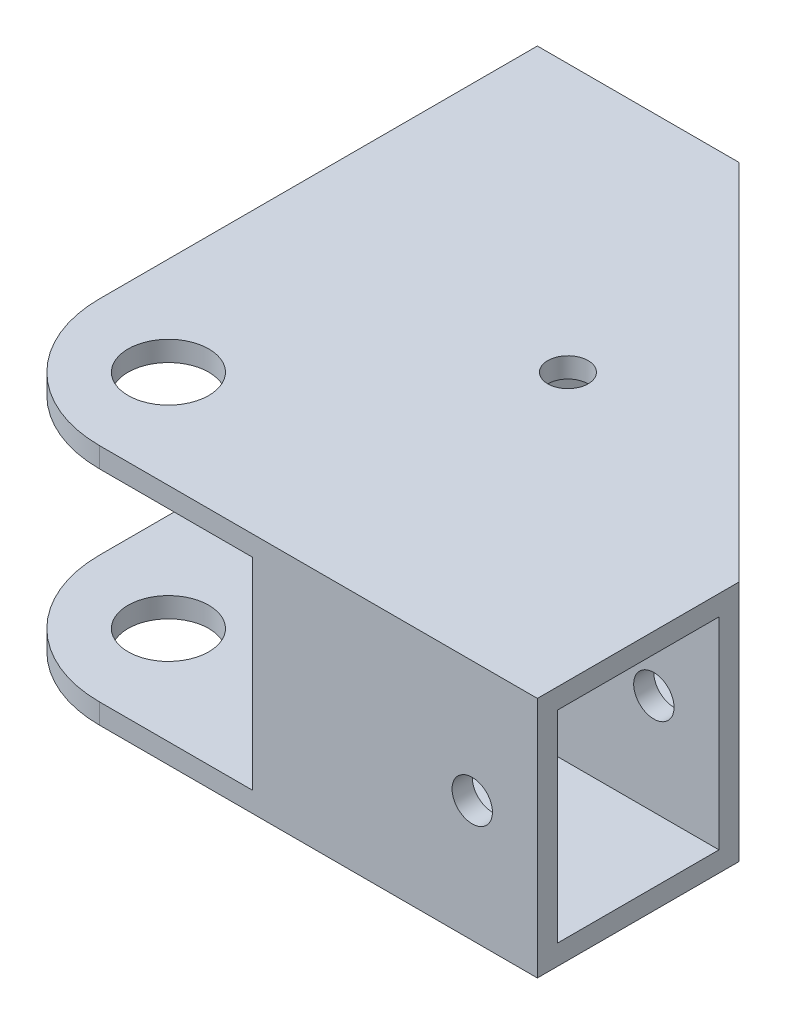
ISO-10303-21;
HEADER;
FILE_DESCRIPTION(('STEP AP214'),'2;1');
FILE_NAME('part.step','',(''),(''),'','','');
FILE_SCHEMA(('AUTOMOTIVE_DESIGN { 1 0 10303 214 1 1 1 1 }'));
ENDSEC;
DATA;
#1=APPLICATION_CONTEXT('core data for automotive mechanical design processes');
#2=APPLICATION_PROTOCOL_DEFINITION('international standard','automotive_design',2000,#1);
#3=PRODUCT_CONTEXT('',#1,'mechanical');
#4=PRODUCT('Part','Part','',(#3));
#5=PRODUCT_RELATED_PRODUCT_CATEGORY('part','',(#4));
#6=PRODUCT_DEFINITION_FORMATION('','',#4);
#7=PRODUCT_DEFINITION_CONTEXT('part definition',#1,'design');
#8=PRODUCT_DEFINITION('design','',#6,#7);
#9=PRODUCT_DEFINITION_SHAPE('','',#8);
#10=(LENGTH_UNIT() NAMED_UNIT(*) SI_UNIT(.MILLI.,.METRE.));
#11=(NAMED_UNIT(*) PLANE_ANGLE_UNIT() SI_UNIT($,.RADIAN.));
#12=(NAMED_UNIT(*) SI_UNIT($,.STERADIAN.) SOLID_ANGLE_UNIT());
#13=UNCERTAINTY_MEASURE_WITH_UNIT(LENGTH_MEASURE(1.E-05),#10,'distance_accuracy_value','');
#14=(GEOMETRIC_REPRESENTATION_CONTEXT(3) GLOBAL_UNCERTAINTY_ASSIGNED_CONTEXT((#13)) GLOBAL_UNIT_ASSIGNED_CONTEXT((#10,
#11,#12)) REPRESENTATION_CONTEXT('',''));
#15=CARTESIAN_POINT('',(0.,0.,0.));
#16=DIRECTION('',(0.,0.,1.));
#17=DIRECTION('',(1.,0.,0.));
#18=AXIS2_PLACEMENT_3D('',#15,#16,#17);
#19=CARTESIAN_POINT('',(-57.15,38.1,-31.75));
#20=DIRECTION('',(0.,0.,1.));
#21=DIRECTION('',(1.,0.,0.));
#22=AXIS2_PLACEMENT_3D('',#19,#20,#21);
#23=PLANE('',#22);
#24=CARTESIAN_POINT('',(-10.25,19.05,-31.75));
#25=DIRECTION('',(0.,0.,1.));
#26=DIRECTION('',(1.,0.,0.));
#27=AXIS2_PLACEMENT_3D('',#24,#25,#26);
#28=CIRCLE('',#27,3.175);
#29=CARTESIAN_POINT('',(-7.075,19.05,-31.75));
#30=VERTEX_POINT('',#29);
#31=EDGE_CURVE('E262',#30,#30,#28,.F.);
#32=ORIENTED_EDGE('',*,*,#31,.F.);
#33=EDGE_LOOP('',(#32));
#34=FACE_BOUND('',#33,.T.);
#35=DIRECTION('',(1.,0.,0.));
#36=VECTOR('',#35,1.);
#37=CARTESIAN_POINT('',(-57.15,3.17500000000001,-31.75));
#38=LINE('',#37,#36);
#39=CARTESIAN_POINT('',(-52.15,3.17500000000001,-31.75));
#40=VERTEX_POINT('',#39);
#41=CARTESIAN_POINT('',(0.,3.17500000000002,-31.75));
#42=VERTEX_POINT('',#41);
#43=EDGE_CURVE('E401',#40,#42,#38,.T.);
#44=ORIENTED_EDGE('',*,*,#43,.F.);
#45=DIRECTION('',(0.,-1.,0.));
#46=VECTOR('',#45,1.);
#47=CARTESIAN_POINT('',(-52.15,34.925,-31.75));
#48=LINE('',#47,#46);
#49=CARTESIAN_POINT('',(-52.15,34.925,-31.75));
#50=VERTEX_POINT('',#49);
#51=EDGE_CURVE('E196',#40,#50,#48,.F.);
#52=ORIENTED_EDGE('',*,*,#51,.T.);
#53=DIRECTION('',(1.,0.,0.));
#54=VECTOR('',#53,1.);
#55=CARTESIAN_POINT('',(-57.15,34.925,-31.75));
#56=LINE('',#55,#54);
#57=CARTESIAN_POINT('',(0.,34.925,-31.75));
#58=VERTEX_POINT('',#57);
#59=EDGE_CURVE('E189',#50,#58,#56,.T.);
#60=ORIENTED_EDGE('',*,*,#59,.T.);
#61=DIRECTION('',(0.,-1.,0.));
#62=VECTOR('',#61,1.);
#63=CARTESIAN_POINT('',(0.,38.1,-31.75));
#64=LINE('',#63,#62);
#65=EDGE_CURVE('E193',#58,#42,#64,.T.);
#66=ORIENTED_EDGE('',*,*,#65,.T.);
#67=EDGE_LOOP('',(#44,#52,#60,#66));
#68=FACE_BOUND('',#67,.T.);
#69=ADVANCED_FACE('F39',(#34,#68),#23,.F.);
#70=CARTESIAN_POINT('',(-57.15,38.1,-88.9));
#71=DIRECTION('',(-1.,0.,0.));
#72=DIRECTION('',(0.,0.,1.));
#73=AXIS2_PLACEMENT_3D('',#70,#71,#72);
#74=PLANE('',#73);
#75=CARTESIAN_POINT('',(-57.15,19.05,-78.65));
#76=DIRECTION('',(-1.,0.,0.));
#77=DIRECTION('',(0.,0.,1.));
#78=AXIS2_PLACEMENT_3D('',#75,#76,#77);
#79=CIRCLE('',#78,3.175);
#80=CARTESIAN_POINT('',(-57.15,19.05,-75.475));
#81=VERTEX_POINT('',#80);
#82=EDGE_CURVE('E257',#81,#81,#79,.F.);
#83=ORIENTED_EDGE('',*,*,#82,.F.);
#84=EDGE_LOOP('',(#83));
#85=FACE_BOUND('',#84,.T.);
#86=DIRECTION('',(0.,0.,1.));
#87=VECTOR('',#86,1.);
#88=CARTESIAN_POINT('',(-57.15,34.925,-88.9));
#89=LINE('',#88,#87);
#90=CARTESIAN_POINT('',(-57.15,34.925,-88.9));
#91=VERTEX_POINT('',#90);
#92=CARTESIAN_POINT('',(-57.15,34.925,-36.75));
#93=VERTEX_POINT('',#92);
#94=EDGE_CURVE('E201',#91,#93,#89,.T.);
#95=ORIENTED_EDGE('',*,*,#94,.T.);
#96=DIRECTION('',(0.,-1.,0.));
#97=VECTOR('',#96,1.);
#98=CARTESIAN_POINT('',(-57.15,3.17500000000002,-36.75));
#99=LINE('',#98,#97);
#100=CARTESIAN_POINT('',(-57.15,3.17500000000001,-36.75));
#101=VERTEX_POINT('',#100);
#102=EDGE_CURVE('E247',#93,#101,#99,.T.);
#103=ORIENTED_EDGE('',*,*,#102,.T.);
#104=DIRECTION('',(0.,0.,1.));
#105=VECTOR('',#104,1.);
#106=CARTESIAN_POINT('',(-57.15,3.17500000000001,-88.9));
#107=LINE('',#106,#105);
#108=CARTESIAN_POINT('',(-57.15,3.17500000000002,-88.9));
#109=VERTEX_POINT('',#108);
#110=EDGE_CURVE('E400',#109,#101,#107,.T.);
#111=ORIENTED_EDGE('',*,*,#110,.F.);
#112=DIRECTION('',(0.,-1.,0.));
#113=VECTOR('',#112,1.);
#114=CARTESIAN_POINT('',(-57.15,38.1,-88.9));
#115=LINE('',#114,#113);
#116=EDGE_CURVE('E226',#91,#109,#115,.T.);
#117=ORIENTED_EDGE('',*,*,#116,.F.);
#118=EDGE_LOOP('',(#95,#103,#111,#117));
#119=FACE_BOUND('',#118,.T.);
#120=ADVANCED_FACE('F459',(#85,#119),#74,.F.);
#121=CARTESIAN_POINT('',(-129.559838907699,34.925,-3.175));
#122=DIRECTION('',(0.,0.,1.));
#123=DIRECTION('',(1.,0.,0.));
#124=AXIS2_PLACEMENT_3D('',#121,#122,#123);
#125=PLANE('',#124);
#126=CARTESIAN_POINT('',(-10.25,19.05,-3.175));
#127=DIRECTION('',(0.,0.,1.));
#128=DIRECTION('',(1.,0.,0.));
#129=AXIS2_PLACEMENT_3D('',#126,#127,#128);
#130=CIRCLE('',#129,3.175);
#131=CARTESIAN_POINT('',(-7.075,19.05,-3.175));
#132=VERTEX_POINT('',#131);
#133=EDGE_CURVE('E261',#132,#132,#130,.T.);
#134=ORIENTED_EDGE('',*,*,#133,.T.);
#135=EDGE_LOOP('',(#134));
#136=FACE_BOUND('',#135,.T.);
#137=DIRECTION('',(1.,0.,0.));
#138=VECTOR('',#137,1.);
#139=CARTESIAN_POINT('',(-129.559838907699,3.175,-3.175));
#140=LINE('',#139,#138);
#141=CARTESIAN_POINT('',(-41.6638474551887,3.175,-3.175));
#142=VERTEX_POINT('',#141);
#143=CARTESIAN_POINT('',(0.,3.175,-3.175));
#144=VERTEX_POINT('',#143);
#145=EDGE_CURVE('E359',#142,#144,#140,.T.);
#146=ORIENTED_EDGE('',*,*,#145,.F.);
#147=DIRECTION('',(0.,1.,0.));
#148=VECTOR('',#147,1.);
#149=CARTESIAN_POINT('',(-41.6638474551887,34.925,-3.175));
#150=LINE('',#149,#148);
#151=CARTESIAN_POINT('',(-41.6638474551887,34.925,-3.175));
#152=VERTEX_POINT('',#151);
#153=EDGE_CURVE('E282',#142,#152,#150,.T.);
#154=ORIENTED_EDGE('',*,*,#153,.T.);
#155=DIRECTION('',(1.,0.,0.));
#156=VECTOR('',#155,1.);
#157=CARTESIAN_POINT('',(-129.559838907699,34.925,-3.175));
#158=LINE('',#157,#156);
#159=CARTESIAN_POINT('',(0.,34.925,-3.175));
#160=VERTEX_POINT('',#159);
#161=EDGE_CURVE('E301',#152,#160,#158,.T.);
#162=ORIENTED_EDGE('',*,*,#161,.T.);
#163=DIRECTION('',(0.,-1.,0.));
#164=VECTOR('',#163,1.);
#165=CARTESIAN_POINT('',(0.,34.925,-3.175));
#166=LINE('',#165,#164);
#167=EDGE_CURVE('E347',#160,#144,#166,.T.);
#168=ORIENTED_EDGE('',*,*,#167,.T.);
#169=EDGE_LOOP('',(#146,#154,#162,#168));
#170=FACE_BOUND('',#169,.T.);
#171=ADVANCED_FACE('F465',(#136,#170),#125,.F.);
#172=CARTESIAN_POINT('',(-88.9,38.1,0.));
#173=DIRECTION('',(1.,0.,0.));
#174=DIRECTION('',(0.,0.,-1.));
#175=AXIS2_PLACEMENT_3D('',#172,#173,#174);
#176=PLANE('',#175);
#177=CARTESIAN_POINT('',(-88.9,19.05,-78.65));
#178=DIRECTION('',(-1.,0.,0.));
#179=DIRECTION('',(0.,0.,1.));
#180=AXIS2_PLACEMENT_3D('',#177,#178,#179);
#181=CIRCLE('',#180,3.175);
#182=CARTESIAN_POINT('',(-88.9,19.05,-75.475));
#183=VERTEX_POINT('',#182);
#184=EDGE_CURVE('E420',#183,#183,#181,.T.);
#185=ORIENTED_EDGE('',*,*,#184,.F.);
#186=EDGE_LOOP('',(#185));
#187=FACE_BOUND('',#186,.T.);
#188=DIRECTION('',(0.,1.,0.));
#189=VECTOR('',#188,1.);
#190=CARTESIAN_POINT('',(-88.9,0.,-44.0611525448112));
#191=LINE('',#190,#189);
#192=CARTESIAN_POINT('',(-88.9,3.175,-44.0611525448112));
#193=VERTEX_POINT('',#192);
#194=CARTESIAN_POINT('',(-88.9,34.925,-44.0611525448112));
#195=VERTEX_POINT('',#194);
#196=EDGE_CURVE('E285',#193,#195,#191,.T.);
#197=ORIENTED_EDGE('',*,*,#196,.T.);
#198=DIRECTION('',(0.,0.,-1.));
#199=VECTOR('',#198,1.);
#200=CARTESIAN_POINT('',(-88.9,34.925,-28.575));
#201=LINE('',#200,#199);
#202=CARTESIAN_POINT('',(-88.9,34.925,-20.));
#203=VERTEX_POINT('',#202);
#204=EDGE_CURVE('E342',#203,#195,#201,.T.);
#205=ORIENTED_EDGE('',*,*,#204,.F.);
#206=DIRECTION('',(0.,-1.,0.));
#207=VECTOR('',#206,1.);
#208=CARTESIAN_POINT('',(-88.9,38.1,-20.));
#209=LINE('',#208,#207);
#210=CARTESIAN_POINT('',(-88.9,38.1,-20.));
#211=VERTEX_POINT('',#210);
#212=EDGE_CURVE('E237',#203,#211,#209,.F.);
#213=ORIENTED_EDGE('',*,*,#212,.T.);
#214=DIRECTION('',(0.,0.,1.));
#215=VECTOR('',#214,1.);
#216=CARTESIAN_POINT('',(-88.9,38.1,0.));
#217=LINE('',#216,#215);
#218=CARTESIAN_POINT('',(-88.9,38.1,-88.9));
#219=VERTEX_POINT('',#218);
#220=EDGE_CURVE('E367',#219,#211,#217,.T.);
#221=ORIENTED_EDGE('',*,*,#220,.F.);
#222=DIRECTION('',(0.,-1.,0.));
#223=VECTOR('',#222,1.);
#224=CARTESIAN_POINT('',(-88.9,38.1,-88.9));
#225=LINE('',#224,#223);
#226=CARTESIAN_POINT('',(-88.9,0.,-88.9));
#227=VERTEX_POINT('',#226);
#228=EDGE_CURVE('E381',#219,#227,#225,.T.);
#229=ORIENTED_EDGE('',*,*,#228,.T.);
#230=DIRECTION('',(0.,0.,1.));
#231=VECTOR('',#230,1.);
#232=CARTESIAN_POINT('',(-88.9,0.,0.));
#233=LINE('',#232,#231);
#234=CARTESIAN_POINT('',(-88.9,0.,-20.));
#235=VERTEX_POINT('',#234);
#236=EDGE_CURVE('E376',#227,#235,#233,.T.);
#237=ORIENTED_EDGE('',*,*,#236,.T.);
#238=DIRECTION('',(0.,-1.,0.));
#239=VECTOR('',#238,1.);
#240=CARTESIAN_POINT('',(-88.9,38.1,-20.));
#241=LINE('',#240,#239);
#242=CARTESIAN_POINT('',(-88.9,3.175,-20.));
#243=VERTEX_POINT('',#242);
#244=EDGE_CURVE('E239',#235,#243,#241,.F.);
#245=ORIENTED_EDGE('',*,*,#244,.T.);
#246=DIRECTION('',(0.,0.,1.));
#247=VECTOR('',#246,1.);
#248=CARTESIAN_POINT('',(-88.9,3.175,-3.175));
#249=LINE('',#248,#247);
#250=EDGE_CURVE('E339',#193,#243,#249,.T.);
#251=ORIENTED_EDGE('',*,*,#250,.F.);
#252=EDGE_LOOP('',(#197,#205,#213,#221,#229,#237,#245,#251));
#253=FACE_BOUND('',#252,.T.);
#254=ADVANCED_FACE('F541',(#187,#253),#176,.F.);
#255=CARTESIAN_POINT('',(0.,38.1,0.));
#256=DIRECTION('',(0.,0.,-1.));
#257=DIRECTION('',(-1.,0.,0.));
#258=AXIS2_PLACEMENT_3D('',#255,#256,#257);
#259=PLANE('',#258);
#260=CARTESIAN_POINT('',(-10.25,19.05,0.));
#261=DIRECTION('',(0.,0.,1.));
#262=DIRECTION('',(1.,0.,0.));
#263=AXIS2_PLACEMENT_3D('',#260,#261,#262);
#264=CIRCLE('',#263,3.175);
#265=CARTESIAN_POINT('',(-7.075,19.05,0.));
#266=VERTEX_POINT('',#265);
#267=EDGE_CURVE('E409',#266,#266,#264,.T.);
#268=ORIENTED_EDGE('',*,*,#267,.F.);
#269=EDGE_LOOP('',(#268));
#270=FACE_BOUND('',#269,.T.);
#271=DIRECTION('',(0.,-1.,0.));
#272=VECTOR('',#271,1.);
#273=CARTESIAN_POINT('',(-44.8388474551888,0.,0.));
#274=LINE('',#273,#272);
#275=CARTESIAN_POINT('',(-44.8388474551888,34.925,0.));
#276=VERTEX_POINT('',#275);
#277=CARTESIAN_POINT('',(-44.8388474551888,3.175,0.));
#278=VERTEX_POINT('',#277);
#279=EDGE_CURVE('E279',#276,#278,#274,.T.);
#280=ORIENTED_EDGE('',*,*,#279,.T.);
#281=DIRECTION('',(1.,0.,0.));
#282=VECTOR('',#281,1.);
#283=CARTESIAN_POINT('',(-60.325,3.175,0.));
#284=LINE('',#283,#282);
#285=CARTESIAN_POINT('',(-68.9,3.175,0.));
#286=VERTEX_POINT('',#285);
#287=EDGE_CURVE('E309',#286,#278,#284,.T.);
#288=ORIENTED_EDGE('',*,*,#287,.F.);
#289=DIRECTION('',(0.,-1.,0.));
#290=VECTOR('',#289,1.);
#291=CARTESIAN_POINT('',(-68.9,38.1,0.));
#292=LINE('',#291,#290);
#293=CARTESIAN_POINT('',(-68.9,0.,0.));
#294=VERTEX_POINT('',#293);
#295=EDGE_CURVE('E232',#286,#294,#292,.T.);
#296=ORIENTED_EDGE('',*,*,#295,.T.);
#297=DIRECTION('',(1.,0.,0.));
#298=VECTOR('',#297,1.);
#299=CARTESIAN_POINT('',(0.,0.,0.));
#300=LINE('',#299,#298);
#301=CARTESIAN_POINT('',(0.,0.,0.));
#302=VERTEX_POINT('',#301);
#303=EDGE_CURVE('E365',#294,#302,#300,.T.);
#304=ORIENTED_EDGE('',*,*,#303,.T.);
#305=DIRECTION('',(0.,-1.,0.));
#306=VECTOR('',#305,1.);
#307=CARTESIAN_POINT('',(0.,38.1,0.));
#308=LINE('',#307,#306);
#309=CARTESIAN_POINT('',(0.,38.1,0.));
#310=VERTEX_POINT('',#309);
#311=EDGE_CURVE('E372',#310,#302,#308,.T.);
#312=ORIENTED_EDGE('',*,*,#311,.F.);
#313=DIRECTION('',(1.,0.,0.));
#314=VECTOR('',#313,1.);
#315=CARTESIAN_POINT('',(0.,38.1,0.));
#316=LINE('',#315,#314);
#317=CARTESIAN_POINT('',(-68.9,38.1,0.));
#318=VERTEX_POINT('',#317);
#319=EDGE_CURVE('E370',#318,#310,#316,.T.);
#320=ORIENTED_EDGE('',*,*,#319,.F.);
#321=DIRECTION('',(0.,-1.,0.));
#322=VECTOR('',#321,1.);
#323=CARTESIAN_POINT('',(-68.9,38.1,0.));
#324=LINE('',#323,#322);
#325=CARTESIAN_POINT('',(-68.9,34.925,0.));
#326=VERTEX_POINT('',#325);
#327=EDGE_CURVE('E214',#318,#326,#324,.T.);
#328=ORIENTED_EDGE('',*,*,#327,.T.);
#329=DIRECTION('',(-1.,0.,0.));
#330=VECTOR('',#329,1.);
#331=CARTESIAN_POINT('',(-85.725,34.925,0.));
#332=LINE('',#331,#330);
#333=EDGE_CURVE('E299',#276,#326,#332,.T.);
#334=ORIENTED_EDGE('',*,*,#333,.F.);
#335=EDGE_LOOP('',(#280,#288,#296,#304,#312,#320,#328,#334));
#336=FACE_BOUND('',#335,.T.);
#337=ADVANCED_FACE('F308',(#270,#336),#259,.F.);
#338=CARTESIAN_POINT('',(-85.725,3.175,40.6598389076986));
#339=DIRECTION('',(-1.,0.,0.));
#340=DIRECTION('',(0.,0.,1.));
#341=AXIS2_PLACEMENT_3D('',#338,#339,#340);
#342=PLANE('',#341);
#343=CARTESIAN_POINT('',(-85.725,19.05,-78.65));
#344=DIRECTION('',(-1.,0.,0.));
#345=DIRECTION('',(0.,0.,1.));
#346=AXIS2_PLACEMENT_3D('',#343,#344,#345);
#347=CIRCLE('',#346,3.175);
#348=CARTESIAN_POINT('',(-85.725,19.05,-75.475));
#349=VERTEX_POINT('',#348);
#350=EDGE_CURVE('E256',#349,#349,#347,.T.);
#351=ORIENTED_EDGE('',*,*,#350,.T.);
#352=EDGE_LOOP('',(#351));
#353=FACE_BOUND('',#352,.T.);
#354=DIRECTION('',(0.,0.,-1.));
#355=VECTOR('',#354,1.);
#356=CARTESIAN_POINT('',(-85.725,34.925,40.6598389076986));
#357=LINE('',#356,#355);
#358=CARTESIAN_POINT('',(-85.725,34.925,-47.2361525448113));
#359=VERTEX_POINT('',#358);
#360=CARTESIAN_POINT('',(-85.725,34.925,-88.9));
#361=VERTEX_POINT('',#360);
#362=EDGE_CURVE('E317',#359,#361,#357,.T.);
#363=ORIENTED_EDGE('',*,*,#362,.F.);
#364=DIRECTION('',(0.,-1.,0.));
#365=VECTOR('',#364,1.);
#366=CARTESIAN_POINT('',(-85.725,3.175,-47.2361525448113));
#367=LINE('',#366,#365);
#368=CARTESIAN_POINT('',(-85.725,3.175,-47.2361525448113));
#369=VERTEX_POINT('',#368);
#370=EDGE_CURVE('E288',#359,#369,#367,.T.);
#371=ORIENTED_EDGE('',*,*,#370,.T.);
#372=DIRECTION('',(0.,0.,-1.));
#373=VECTOR('',#372,1.);
#374=CARTESIAN_POINT('',(-85.725,3.175,40.6598389076986));
#375=LINE('',#374,#373);
#376=CARTESIAN_POINT('',(-85.725,3.175,-88.9));
#377=VERTEX_POINT('',#376);
#378=EDGE_CURVE('E336',#369,#377,#375,.T.);
#379=ORIENTED_EDGE('',*,*,#378,.T.);
#380=DIRECTION('',(0.,1.,0.));
#381=VECTOR('',#380,1.);
#382=CARTESIAN_POINT('',(-85.725,3.175,-88.9));
#383=LINE('',#382,#381);
#384=EDGE_CURVE('E328',#377,#361,#383,.T.);
#385=ORIENTED_EDGE('',*,*,#384,.T.);
#386=EDGE_LOOP('',(#363,#371,#379,#385));
#387=FACE_BOUND('',#386,.T.);
#388=ADVANCED_FACE('F531',(#353,#387),#342,.F.);
#389=CARTESIAN_POINT('',(-129.559838907699,3.175,-28.575));
#390=DIRECTION('',(0.,0.,-1.));
#391=DIRECTION('',(-1.,0.,0.));
#392=AXIS2_PLACEMENT_3D('',#389,#390,#391);
#393=PLANE('',#392);
#394=CARTESIAN_POINT('',(-10.25,19.05,-28.575));
#395=DIRECTION('',(0.,0.,-1.));
#396=DIRECTION('',(-1.,0.,0.));
#397=AXIS2_PLACEMENT_3D('',#394,#395,#396);
#398=CIRCLE('',#397,3.175);
#399=CARTESIAN_POINT('',(-13.425,19.05,-28.575));
#400=VERTEX_POINT('',#399);
#401=EDGE_CURVE('E258',#400,#400,#398,.T.);
#402=ORIENTED_EDGE('',*,*,#401,.T.);
#403=EDGE_LOOP('',(#402));
#404=FACE_BOUND('',#403,.T.);
#405=DIRECTION('',(1.,0.,0.));
#406=VECTOR('',#405,1.);
#407=CARTESIAN_POINT('',(-129.559838907699,34.925,-28.575));
#408=LINE('',#407,#406);
#409=CARTESIAN_POINT('',(-55.325,34.925,-28.575));
#410=VERTEX_POINT('',#409);
#411=CARTESIAN_POINT('',(0.,34.925,-28.575));
#412=VERTEX_POINT('',#411);
#413=EDGE_CURVE('E343',#410,#412,#408,.T.);
#414=ORIENTED_EDGE('',*,*,#413,.F.);
#415=DIRECTION('',(0.,-1.,0.));
#416=VECTOR('',#415,1.);
#417=CARTESIAN_POINT('',(-55.325,3.175,-28.575));
#418=LINE('',#417,#416);
#419=CARTESIAN_POINT('',(-55.325,3.175,-28.575));
#420=VERTEX_POINT('',#419);
#421=EDGE_CURVE('E270',#410,#420,#418,.T.);
#422=ORIENTED_EDGE('',*,*,#421,.T.);
#423=DIRECTION('',(1.,0.,0.));
#424=VECTOR('',#423,1.);
#425=CARTESIAN_POINT('',(-129.559838907699,3.175,-28.575));
#426=LINE('',#425,#424);
#427=CARTESIAN_POINT('',(0.,3.175,-28.575));
#428=VERTEX_POINT('',#427);
#429=EDGE_CURVE('E357',#420,#428,#426,.T.);
#430=ORIENTED_EDGE('',*,*,#429,.T.);
#431=DIRECTION('',(0.,1.,0.));
#432=VECTOR('',#431,1.);
#433=CARTESIAN_POINT('',(0.,3.175,-28.575));
#434=LINE('',#433,#432);
#435=EDGE_CURVE('E353',#428,#412,#434,.T.);
#436=ORIENTED_EDGE('',*,*,#435,.T.);
#437=EDGE_LOOP('',(#414,#422,#430,#436));
#438=FACE_BOUND('',#437,.T.);
#439=ADVANCED_FACE('F473',(#404,#438),#393,.F.);
#440=CARTESIAN_POINT('',(0.,38.1,-31.75));
#441=DIRECTION('',(-1.,0.,0.));
#442=DIRECTION('',(0.,0.,1.));
#443=AXIS2_PLACEMENT_3D('',#440,#441,#442);
#444=PLANE('',#443);
#445=ORIENTED_EDGE('',*,*,#167,.F.);
#446=DIRECTION('',(0.,0.,1.));
#447=VECTOR('',#446,1.);
#448=CARTESIAN_POINT('',(0.,34.925,-28.575));
#449=LINE('',#448,#447);
#450=EDGE_CURVE('E315',#412,#160,#449,.T.);
#451=ORIENTED_EDGE('',*,*,#450,.F.);
#452=ORIENTED_EDGE('',*,*,#435,.F.);
#453=DIRECTION('',(0.,0.,-1.));
#454=VECTOR('',#453,1.);
#455=CARTESIAN_POINT('',(0.,3.175,-3.175));
#456=LINE('',#455,#454);
#457=EDGE_CURVE('E350',#144,#428,#456,.T.);
#458=ORIENTED_EDGE('',*,*,#457,.F.);
#459=EDGE_LOOP('',(#445,#451,#452,#458));
#460=FACE_BOUND('',#459,.T.);
#461=DIRECTION('',(0.,0.,-1.));
#462=VECTOR('',#461,1.);
#463=CARTESIAN_POINT('',(0.,0.,-31.75));
#464=LINE('',#463,#462);
#465=CARTESIAN_POINT('',(0.,0.,-31.75));
#466=VERTEX_POINT('',#465);
#467=EDGE_CURVE('E345',#302,#466,#464,.T.);
#468=ORIENTED_EDGE('',*,*,#467,.T.);
#469=DIRECTION('',(0.,-1.,0.));
#470=VECTOR('',#469,1.);
#471=CARTESIAN_POINT('',(0.,3.17500000000001,-31.75));
#472=LINE('',#471,#470);
#473=EDGE_CURVE('E223',#42,#466,#472,.T.);
#474=ORIENTED_EDGE('',*,*,#473,.F.);
#475=ORIENTED_EDGE('',*,*,#65,.F.);
#476=CARTESIAN_POINT('',(0.,38.1,-31.75));
#477=VERTEX_POINT('',#476);
#478=EDGE_CURVE('E206',#477,#58,#64,.T.);
#479=ORIENTED_EDGE('',*,*,#478,.F.);
#480=DIRECTION('',(0.,0.,-1.));
#481=VECTOR('',#480,1.);
#482=CARTESIAN_POINT('',(0.,38.1,-31.75));
#483=LINE('',#482,#481);
#484=EDGE_CURVE('E362',#310,#477,#483,.T.);
#485=ORIENTED_EDGE('',*,*,#484,.F.);
#486=ORIENTED_EDGE('',*,*,#311,.T.);
#487=EDGE_LOOP('',(#468,#474,#475,#479,#485,#486));
#488=FACE_BOUND('',#487,.T.);
#489=ADVANCED_FACE('F221',(#460,#488),#444,.F.);
#490=CARTESIAN_POINT('',(-88.9,38.1,-88.9));
#491=DIRECTION('',(0.,0.,1.));
#492=DIRECTION('',(1.,0.,0.));
#493=AXIS2_PLACEMENT_3D('',#490,#491,#492);
#494=PLANE('',#493);
#495=DIRECTION('',(-1.,0.,0.));
#496=VECTOR('',#495,1.);
#497=CARTESIAN_POINT('',(-60.325,3.175,-88.9));
#498=LINE('',#497,#496);
#499=CARTESIAN_POINT('',(-60.325,3.175,-88.9));
#500=VERTEX_POINT('',#499);
#501=EDGE_CURVE('E325',#500,#377,#498,.T.);
#502=ORIENTED_EDGE('',*,*,#501,.F.);
#503=DIRECTION('',(0.,-1.,0.));
#504=VECTOR('',#503,1.);
#505=CARTESIAN_POINT('',(-60.325,34.925,-88.9));
#506=LINE('',#505,#504);
#507=CARTESIAN_POINT('',(-60.325,34.925,-88.9));
#508=VERTEX_POINT('',#507);
#509=EDGE_CURVE('E322',#508,#500,#506,.T.);
#510=ORIENTED_EDGE('',*,*,#509,.F.);
#511=DIRECTION('',(1.,0.,0.));
#512=VECTOR('',#511,1.);
#513=CARTESIAN_POINT('',(-85.725,34.925,-88.9));
#514=LINE('',#513,#512);
#515=EDGE_CURVE('E331',#361,#508,#514,.T.);
#516=ORIENTED_EDGE('',*,*,#515,.F.);
#517=ORIENTED_EDGE('',*,*,#384,.F.);
#518=EDGE_LOOP('',(#502,#510,#516,#517));
#519=FACE_BOUND('',#518,.T.);
#520=DIRECTION('',(-1.,0.,0.));
#521=VECTOR('',#520,1.);
#522=CARTESIAN_POINT('',(-88.9,0.,-88.9));
#523=LINE('',#522,#521);
#524=CARTESIAN_POINT('',(-57.15,0.,-88.9));
#525=VERTEX_POINT('',#524);
#526=EDGE_CURVE('E374',#525,#227,#523,.T.);
#527=ORIENTED_EDGE('',*,*,#526,.T.);
#528=ORIENTED_EDGE('',*,*,#228,.F.);
#529=DIRECTION('',(-1.,0.,0.));
#530=VECTOR('',#529,1.);
#531=CARTESIAN_POINT('',(-88.9,38.1,-88.9));
#532=LINE('',#531,#530);
#533=CARTESIAN_POINT('',(-57.15,38.1,-88.9));
#534=VERTEX_POINT('',#533);
#535=EDGE_CURVE('E364',#534,#219,#532,.T.);
#536=ORIENTED_EDGE('',*,*,#535,.F.);
#537=EDGE_CURVE('E224',#534,#91,#115,.T.);
#538=ORIENTED_EDGE('',*,*,#537,.T.);
#539=ORIENTED_EDGE('',*,*,#116,.T.);
#540=DIRECTION('',(0.,-1.,0.));
#541=VECTOR('',#540,1.);
#542=CARTESIAN_POINT('',(-57.15,3.17500000000001,-88.9));
#543=LINE('',#542,#541);
#544=EDGE_CURVE('E392',#109,#525,#543,.T.);
#545=ORIENTED_EDGE('',*,*,#544,.T.);
#546=EDGE_LOOP('',(#527,#528,#536,#538,#539,#545));
#547=FACE_BOUND('',#546,.T.);
#548=ADVANCED_FACE('F390',(#519,#547),#494,.F.);
#549=CARTESIAN_POINT('',(0.,38.1,0.));
#550=DIRECTION('',(0.,-1.,0.));
#551=DIRECTION('',(0.,0.,-1.));
#552=AXIS2_PLACEMENT_3D('',#549,#550,#551);
#553=PLANE('',#552);
#554=CARTESIAN_POINT('',(-42.0453841816037,38.1,-46.8546158183963));
#555=DIRECTION('',(0.,-1.,0.));
#556=DIRECTION('',(0.,0.,-1.));
#557=AXIS2_PLACEMENT_3D('',#554,#555,#556);
#558=CIRCLE('',#557,3.175);
#559=CARTESIAN_POINT('',(-42.0453841816037,38.1,-50.0296158183963));
#560=VERTEX_POINT('',#559);
#561=EDGE_CURVE('E871',#560,#560,#558,.F.);
#562=ORIENTED_EDGE('',*,*,#561,.F.);
#563=EDGE_LOOP('',(#562));
#564=FACE_BOUND('',#563,.T.);
#565=DIRECTION('',(-0.707106781186547,0.,-0.707106781186548));
#566=VECTOR('',#565,1.);
#567=CARTESIAN_POINT('',(-57.15,38.1,-88.9));
#568=LINE('',#567,#566);
#569=EDGE_CURVE('E210',#477,#534,#568,.T.);
#570=ORIENTED_EDGE('',*,*,#569,.T.);
#571=ORIENTED_EDGE('',*,*,#535,.T.);
#572=ORIENTED_EDGE('',*,*,#220,.T.);
#573=CARTESIAN_POINT('',(-68.9,38.1,-20.));
#574=DIRECTION('',(0.,-1.,0.));
#575=DIRECTION('',(0.,0.,-1.));
#576=AXIS2_PLACEMENT_3D('',#573,#574,#575);
#577=CIRCLE('',#576,20.);
#578=EDGE_CURVE('E245',#211,#318,#577,.F.);
#579=ORIENTED_EDGE('',*,*,#578,.T.);
#580=ORIENTED_EDGE('',*,*,#319,.T.);
#581=ORIENTED_EDGE('',*,*,#484,.T.);
#582=EDGE_LOOP('',(#570,#571,#572,#579,#580,#581));
#583=FACE_BOUND('',#582,.T.);
#584=CARTESIAN_POINT('',(-73.4762806053458,38.1,-15.4237193946542));
#585=DIRECTION('',(0.,-1.,0.));
#586=DIRECTION('',(0.,0.,-1.));
#587=AXIS2_PLACEMENT_3D('',#584,#585,#586);
#588=CIRCLE('',#587,6.35);
#589=CARTESIAN_POINT('',(-73.4762806053458,38.1,-21.7737193946542));
#590=VERTEX_POINT('',#589);
#591=EDGE_CURVE('E252',#590,#590,#588,.T.);
#592=ORIENTED_EDGE('',*,*,#591,.T.);
#593=EDGE_LOOP('',(#592));
#594=FACE_BOUND('',#593,.T.);
#595=ADVANCED_FACE('F433',(#564,#583,#594),#553,.F.);
#596=CARTESIAN_POINT('',(0.,0.,0.));
#597=DIRECTION('',(0.,-1.,0.));
#598=DIRECTION('',(0.,0.,-1.));
#599=AXIS2_PLACEMENT_3D('',#596,#597,#598);
#600=PLANE('',#599);
#601=CARTESIAN_POINT('',(-42.0453841816037,0.,-46.8546158183963));
#602=DIRECTION('',(0.,-1.,0.));
#603=DIRECTION('',(0.,0.,-1.));
#604=AXIS2_PLACEMENT_3D('',#601,#602,#603);
#605=CIRCLE('',#604,3.175);
#606=CARTESIAN_POINT('',(-42.0453841816037,0.,-50.0296158183963));
#607=VERTEX_POINT('',#606);
#608=EDGE_CURVE('E874',#607,#607,#605,.T.);
#609=ORIENTED_EDGE('',*,*,#608,.F.);
#610=EDGE_LOOP('',(#609));
#611=FACE_BOUND('',#610,.T.);
#612=ORIENTED_EDGE('',*,*,#526,.F.);
#613=DIRECTION('',(-0.707106781186547,0.,-0.707106781186548));
#614=VECTOR('',#613,1.);
#615=CARTESIAN_POINT('',(-57.15,0.,-88.9));
#616=LINE('',#615,#614);
#617=EDGE_CURVE('E407',#466,#525,#616,.T.);
#618=ORIENTED_EDGE('',*,*,#617,.F.);
#619=ORIENTED_EDGE('',*,*,#467,.F.);
#620=ORIENTED_EDGE('',*,*,#303,.F.);
#621=CARTESIAN_POINT('',(-68.9,0.,-20.));
#622=DIRECTION('',(0.,-1.,0.));
#623=DIRECTION('',(0.,0.,-1.));
#624=AXIS2_PLACEMENT_3D('',#621,#622,#623);
#625=CIRCLE('',#624,20.);
#626=EDGE_CURVE('E235',#294,#235,#625,.T.);
#627=ORIENTED_EDGE('',*,*,#626,.T.);
#628=ORIENTED_EDGE('',*,*,#236,.F.);
#629=EDGE_LOOP('',(#612,#618,#619,#620,#627,#628));
#630=FACE_BOUND('',#629,.T.);
#631=CARTESIAN_POINT('',(-73.4762806053458,0.,-15.4237193946542));
#632=DIRECTION('',(0.,-1.,0.));
#633=DIRECTION('',(0.,0.,-1.));
#634=AXIS2_PLACEMENT_3D('',#631,#632,#633);
#635=CIRCLE('',#634,6.35);
#636=CARTESIAN_POINT('',(-73.4762806053458,0.,-21.7737193946542));
#637=VERTEX_POINT('',#636);
#638=EDGE_CURVE('E218',#637,#637,#635,.T.);
#639=ORIENTED_EDGE('',*,*,#638,.F.);
#640=EDGE_LOOP('',(#639));
#641=FACE_BOUND('',#640,.T.);
#642=ADVANCED_FACE('F445',(#611,#630,#641),#600,.T.);
#643=CARTESIAN_POINT('',(-129.559838907699,34.925,-28.575));
#644=DIRECTION('',(0.,1.,0.));
#645=DIRECTION('',(0.,0.,1.));
#646=AXIS2_PLACEMENT_3D('',#643,#644,#645);
#647=PLANE('',#646);
#648=CARTESIAN_POINT('',(-73.4762806053458,34.925,-15.4237193946542));
#649=DIRECTION('',(0.,1.,0.));
#650=DIRECTION('',(0.,0.,1.));
#651=AXIS2_PLACEMENT_3D('',#648,#649,#650);
#652=CIRCLE('',#651,6.35);
#653=CARTESIAN_POINT('',(-73.4762806053458,34.925,-9.07371939465423));
#654=VERTEX_POINT('',#653);
#655=EDGE_CURVE('E251',#654,#654,#652,.T.);
#656=ORIENTED_EDGE('',*,*,#655,.T.);
#657=EDGE_LOOP('',(#656));
#658=FACE_BOUND('',#657,.T.);
#659=ORIENTED_EDGE('',*,*,#333,.T.);
#660=CARTESIAN_POINT('',(-68.9,34.925,-20.));
#661=DIRECTION('',(0.,1.,0.));
#662=DIRECTION('',(0.,0.,1.));
#663=AXIS2_PLACEMENT_3D('',#660,#661,#662);
#664=CIRCLE('',#663,20.);
#665=EDGE_CURVE('E243',#326,#203,#664,.F.);
#666=ORIENTED_EDGE('',*,*,#665,.T.);
#667=ORIENTED_EDGE('',*,*,#204,.T.);
#668=DIRECTION('',(0.707106781186543,0.,-0.707106781186552));
#669=VECTOR('',#668,1.);
#670=CARTESIAN_POINT('',(-116.972995726255,34.925,-15.9881568185562));
#671=LINE('',#670,#669);
#672=EDGE_CURVE('E49',#195,#359,#671,.T.);
#673=ORIENTED_EDGE('',*,*,#672,.T.);
#674=ORIENTED_EDGE('',*,*,#362,.T.);
#675=ORIENTED_EDGE('',*,*,#515,.T.);
#676=DIRECTION('',(0.,0.,-1.));
#677=VECTOR('',#676,1.);
#678=CARTESIAN_POINT('',(-60.325,34.925,40.6598389076986));
#679=LINE('',#678,#677);
#680=CARTESIAN_POINT('',(-60.325,34.925,-33.575));
#681=VERTEX_POINT('',#680);
#682=EDGE_CURVE('E313',#681,#508,#679,.T.);
#683=ORIENTED_EDGE('',*,*,#682,.F.);
#684=CARTESIAN_POINT('',(-55.325,34.925,-33.575));
#685=DIRECTION('',(0.,1.,0.));
#686=DIRECTION('',(0.,0.,1.));
#687=AXIS2_PLACEMENT_3D('',#684,#685,#686);
#688=CIRCLE('',#687,5.);
#689=EDGE_CURVE('E277',#681,#410,#688,.T.);
#690=ORIENTED_EDGE('',*,*,#689,.T.);
#691=ORIENTED_EDGE('',*,*,#413,.T.);
#692=ORIENTED_EDGE('',*,*,#450,.T.);
#693=ORIENTED_EDGE('',*,*,#161,.F.);
#694=DIRECTION('',(-0.707106781186555,0.,0.70710678118654));
#695=VECTOR('',#694,1.);
#696=CARTESIAN_POINT('',(-72.9118431814446,34.925,28.0729957262552));
#697=LINE('',#696,#695);
#698=EDGE_CURVE('E292',#152,#276,#697,.T.);
#699=ORIENTED_EDGE('',*,*,#698,.T.);
#700=EDGE_LOOP('',(#659,#666,#667,#673,#674,#675,#683,#690,#691,#692,#693,#699));
#701=FACE_BOUND('',#700,.T.);
#702=ADVANCED_FACE('F298',(#658,#701),#647,.F.);
#703=CARTESIAN_POINT('',(-129.559838907699,3.175,-3.175));
#704=DIRECTION('',(0.,-1.,0.));
#705=DIRECTION('',(0.,0.,-1.));
#706=AXIS2_PLACEMENT_3D('',#703,#704,#705);
#707=PLANE('',#706);
#708=CARTESIAN_POINT('',(-73.4762806053458,3.175,-15.4237193946542));
#709=DIRECTION('',(0.,-1.,0.));
#710=DIRECTION('',(0.,0.,-1.));
#711=AXIS2_PLACEMENT_3D('',#708,#709,#710);
#712=CIRCLE('',#711,6.35);
#713=CARTESIAN_POINT('',(-73.4762806053458,3.175,-21.7737193946542));
#714=VERTEX_POINT('',#713);
#715=EDGE_CURVE('E248',#714,#714,#712,.T.);
#716=ORIENTED_EDGE('',*,*,#715,.T.);
#717=EDGE_LOOP('',(#716));
#718=FACE_BOUND('',#717,.T.);
#719=ORIENTED_EDGE('',*,*,#250,.T.);
#720=CARTESIAN_POINT('',(-68.9,3.175,-20.));
#721=DIRECTION('',(0.,-1.,0.));
#722=DIRECTION('',(0.,0.,-1.));
#723=AXIS2_PLACEMENT_3D('',#720,#721,#722);
#724=CIRCLE('',#723,20.);
#725=EDGE_CURVE('E241',#243,#286,#724,.F.);
#726=ORIENTED_EDGE('',*,*,#725,.T.);
#727=ORIENTED_EDGE('',*,*,#287,.T.);
#728=DIRECTION('',(0.707106781186555,0.,-0.70710678118654));
#729=VECTOR('',#728,1.);
#730=CARTESIAN_POINT('',(-85.6118431814446,3.175,40.7729957262549));
#731=LINE('',#730,#729);
#732=EDGE_CURVE('E290',#278,#142,#731,.T.);
#733=ORIENTED_EDGE('',*,*,#732,.T.);
#734=ORIENTED_EDGE('',*,*,#145,.T.);
#735=ORIENTED_EDGE('',*,*,#457,.T.);
#736=ORIENTED_EDGE('',*,*,#429,.F.);
#737=CARTESIAN_POINT('',(-55.325,3.175,-33.575));
#738=DIRECTION('',(0.,-1.,0.));
#739=DIRECTION('',(0.,0.,-1.));
#740=AXIS2_PLACEMENT_3D('',#737,#738,#739);
#741=CIRCLE('',#740,5.);
#742=CARTESIAN_POINT('',(-60.325,3.175,-33.575));
#743=VERTEX_POINT('',#742);
#744=EDGE_CURVE('E275',#420,#743,#741,.T.);
#745=ORIENTED_EDGE('',*,*,#744,.T.);
#746=DIRECTION('',(0.,0.,-1.));
#747=VECTOR('',#746,1.);
#748=CARTESIAN_POINT('',(-60.325,3.175,40.6598389076986));
#749=LINE('',#748,#747);
#750=EDGE_CURVE('E333',#743,#500,#749,.T.);
#751=ORIENTED_EDGE('',*,*,#750,.T.);
#752=ORIENTED_EDGE('',*,*,#501,.T.);
#753=ORIENTED_EDGE('',*,*,#378,.F.);
#754=DIRECTION('',(-0.707106781186543,0.,0.707106781186552));
#755=VECTOR('',#754,1.);
#756=CARTESIAN_POINT('',(-129.672995726255,3.175,-3.28815681855605));
#757=LINE('',#756,#755);
#758=EDGE_CURVE('E11',#369,#193,#757,.T.);
#759=ORIENTED_EDGE('',*,*,#758,.T.);
#760=EDGE_LOOP('',(#719,#726,#727,#733,#734,#735,#736,#745,#751,#752,#753,#759));
#761=FACE_BOUND('',#760,.T.);
#762=ADVANCED_FACE('F444',(#718,#761),#707,.F.);
#763=CARTESIAN_POINT('',(-60.325,34.925,40.6598389076986));
#764=DIRECTION('',(1.,0.,0.));
#765=DIRECTION('',(0.,0.,-1.));
#766=AXIS2_PLACEMENT_3D('',#763,#764,#765);
#767=PLANE('',#766);
#768=CARTESIAN_POINT('',(-60.325,19.05,-78.65));
#769=DIRECTION('',(1.,0.,0.));
#770=DIRECTION('',(0.,0.,-1.));
#771=AXIS2_PLACEMENT_3D('',#768,#769,#770);
#772=CIRCLE('',#771,3.175);
#773=CARTESIAN_POINT('',(-60.325,19.05,-81.825));
#774=VERTEX_POINT('',#773);
#775=EDGE_CURVE('E253',#774,#774,#772,.T.);
#776=ORIENTED_EDGE('',*,*,#775,.T.);
#777=EDGE_LOOP('',(#776));
#778=FACE_BOUND('',#777,.T.);
#779=ORIENTED_EDGE('',*,*,#750,.F.);
#780=DIRECTION('',(0.,-1.,0.));
#781=VECTOR('',#780,1.);
#782=CARTESIAN_POINT('',(-60.325,34.925,-33.575));
#783=LINE('',#782,#781);
#784=EDGE_CURVE('E273',#743,#681,#783,.F.);
#785=ORIENTED_EDGE('',*,*,#784,.T.);
#786=ORIENTED_EDGE('',*,*,#682,.T.);
#787=ORIENTED_EDGE('',*,*,#509,.T.);
#788=EDGE_LOOP('',(#779,#785,#786,#787));
#789=FACE_BOUND('',#788,.T.);
#790=ADVANCED_FACE('F451',(#778,#789),#767,.F.);
#791=CARTESIAN_POINT('',(-68.9,38.1,-20.));
#792=DIRECTION('',(0.,-1.,0.));
#793=DIRECTION('',(0.,0.,-1.));
#794=AXIS2_PLACEMENT_3D('',#791,#792,#793);
#795=CYLINDRICAL_SURFACE('',#794,20.);
#796=ORIENTED_EDGE('',*,*,#725,.F.);
#797=ORIENTED_EDGE('',*,*,#244,.F.);
#798=ORIENTED_EDGE('',*,*,#626,.F.);
#799=ORIENTED_EDGE('',*,*,#295,.F.);
#800=EDGE_LOOP('',(#796,#797,#798,#799));
#801=FACE_BOUND('',#800,.T.);
#802=ADVANCED_FACE('F475',(#801),#795,.T.);
#803=CARTESIAN_POINT('',(-68.9,38.1,-20.));
#804=DIRECTION('',(0.,-1.,0.));
#805=DIRECTION('',(0.,0.,-1.));
#806=AXIS2_PLACEMENT_3D('',#803,#804,#805);
#807=CYLINDRICAL_SURFACE('',#806,20.);
#808=ORIENTED_EDGE('',*,*,#578,.F.);
#809=ORIENTED_EDGE('',*,*,#212,.F.);
#810=ORIENTED_EDGE('',*,*,#665,.F.);
#811=ORIENTED_EDGE('',*,*,#327,.F.);
#812=EDGE_LOOP('',(#808,#809,#810,#811));
#813=FACE_BOUND('',#812,.T.);
#814=ADVANCED_FACE('F478',(#813),#807,.T.);
#815=CARTESIAN_POINT('',(-73.4762806053458,38.1,-15.4237193946542));
#816=DIRECTION('',(0.,-1.,0.));
#817=DIRECTION('',(0.,0.,-1.));
#818=AXIS2_PLACEMENT_3D('',#815,#816,#817);
#819=CYLINDRICAL_SURFACE('',#818,6.35);
#820=ORIENTED_EDGE('',*,*,#638,.T.);
#821=EDGE_LOOP('',(#820));
#822=FACE_BOUND('',#821,.T.);
#823=ORIENTED_EDGE('',*,*,#715,.F.);
#824=EDGE_LOOP('',(#823));
#825=FACE_BOUND('',#824,.T.);
#826=ADVANCED_FACE('F438',(#822,#825),#819,.F.);
#827=ORIENTED_EDGE('',*,*,#591,.F.);
#828=EDGE_LOOP('',(#827));
#829=FACE_BOUND('',#828,.T.);
#830=ORIENTED_EDGE('',*,*,#655,.F.);
#831=EDGE_LOOP('',(#830));
#832=FACE_BOUND('',#831,.T.);
#833=ADVANCED_FACE('F435',(#829,#832),#819,.F.);
#834=CARTESIAN_POINT('',(-57.15,34.925,-88.9));
#835=DIRECTION('',(0.707106781186548,0.,-0.707106781186547));
#836=DIRECTION('',(-0.707106781186547,0.,-0.707106781186548));
#837=AXIS2_PLACEMENT_3D('',#834,#835,#836);
#838=PLANE('',#837);
#839=ORIENTED_EDGE('',*,*,#569,.F.);
#840=ORIENTED_EDGE('',*,*,#478,.T.);
#841=DIRECTION('',(-0.707106781186547,0.,-0.707106781186548));
#842=VECTOR('',#841,1.);
#843=CARTESIAN_POINT('',(-57.15,34.925,-88.9));
#844=LINE('',#843,#842);
#845=EDGE_CURVE('E200',#58,#91,#844,.T.);
#846=ORIENTED_EDGE('',*,*,#845,.T.);
#847=ORIENTED_EDGE('',*,*,#537,.F.);
#848=EDGE_LOOP('',(#839,#840,#846,#847));
#849=FACE_BOUND('',#848,.T.);
#850=ADVANCED_FACE('F207',(#849),#838,.T.);
#851=CARTESIAN_POINT('',(0.,34.925,0.));
#852=DIRECTION('',(0.,1.,0.));
#853=DIRECTION('',(0.,0.,1.));
#854=AXIS2_PLACEMENT_3D('',#851,#852,#853);
#855=PLANE('',#854);
#856=CARTESIAN_POINT('',(-42.0453841816037,34.925,-46.8546158183963));
#857=DIRECTION('',(0.,1.,0.));
#858=DIRECTION('',(0.,0.,1.));
#859=AXIS2_PLACEMENT_3D('',#856,#857,#858);
#860=CIRCLE('',#859,3.175);
#861=CARTESIAN_POINT('',(-42.0453841816037,34.925,-43.6796158183963));
#862=VERTEX_POINT('',#861);
#863=EDGE_CURVE('E867',#862,#862,#860,.T.);
#864=ORIENTED_EDGE('',*,*,#863,.T.);
#865=EDGE_LOOP('',(#864));
#866=FACE_BOUND('',#865,.T.);
#867=ORIENTED_EDGE('',*,*,#59,.F.);
#868=CARTESIAN_POINT('',(-52.15,34.925,-36.75));
#869=DIRECTION('',(0.,1.,0.));
#870=DIRECTION('',(0.,0.,1.));
#871=AXIS2_PLACEMENT_3D('',#868,#869,#870);
#872=CIRCLE('',#871,5.);
#873=EDGE_CURVE('E268',#50,#93,#872,.F.);
#874=ORIENTED_EDGE('',*,*,#873,.T.);
#875=ORIENTED_EDGE('',*,*,#94,.F.);
#876=ORIENTED_EDGE('',*,*,#845,.F.);
#877=EDGE_LOOP('',(#867,#874,#875,#876));
#878=FACE_BOUND('',#877,.T.);
#879=ADVANCED_FACE('F216',(#866,#878),#855,.F.);
#880=CARTESIAN_POINT('',(-48.1697438789309,19.05,-78.65));
#881=DIRECTION('',(-1.,0.,0.));
#882=DIRECTION('',(0.,0.,1.));
#883=AXIS2_PLACEMENT_3D('',#880,#881,#882);
#884=CYLINDRICAL_SURFACE('',#883,3.175);
#885=ORIENTED_EDGE('',*,*,#82,.T.);
#886=EDGE_LOOP('',(#885));
#887=FACE_BOUND('',#886,.T.);
#888=ORIENTED_EDGE('',*,*,#775,.F.);
#889=EDGE_LOOP('',(#888));
#890=FACE_BOUND('',#889,.T.);
#891=ADVANCED_FACE('F524',(#887,#890),#884,.F.);
#892=ORIENTED_EDGE('',*,*,#184,.T.);
#893=EDGE_LOOP('',(#892));
#894=FACE_BOUND('',#893,.T.);
#895=ORIENTED_EDGE('',*,*,#350,.F.);
#896=EDGE_LOOP('',(#895));
#897=FACE_BOUND('',#896,.T.);
#898=ADVANCED_FACE('F521',(#894,#897),#884,.F.);
#899=CARTESIAN_POINT('',(-10.25,19.05,-40.7302561210691));
#900=DIRECTION('',(0.,0.,1.));
#901=DIRECTION('',(1.,0.,0.));
#902=AXIS2_PLACEMENT_3D('',#899,#900,#901);
#903=CYLINDRICAL_SURFACE('',#902,3.175);
#904=ORIENTED_EDGE('',*,*,#31,.T.);
#905=EDGE_LOOP('',(#904));
#906=FACE_BOUND('',#905,.T.);
#907=ORIENTED_EDGE('',*,*,#401,.F.);
#908=EDGE_LOOP('',(#907));
#909=FACE_BOUND('',#908,.T.);
#910=ADVANCED_FACE('F519',(#906,#909),#903,.F.);
#911=ORIENTED_EDGE('',*,*,#267,.T.);
#912=EDGE_LOOP('',(#911));
#913=FACE_BOUND('',#912,.T.);
#914=ORIENTED_EDGE('',*,*,#133,.F.);
#915=EDGE_LOOP('',(#914));
#916=FACE_BOUND('',#915,.T.);
#917=ADVANCED_FACE('F516',(#913,#916),#903,.F.);
#918=CARTESIAN_POINT('',(-57.15,3.17500000000001,-88.9));
#919=DIRECTION('',(-0.707106781186548,0.,0.707106781186547));
#920=DIRECTION('',(0.707106781186547,0.,0.707106781186548));
#921=AXIS2_PLACEMENT_3D('',#918,#919,#920);
#922=PLANE('',#921);
#923=ORIENTED_EDGE('',*,*,#617,.T.);
#924=ORIENTED_EDGE('',*,*,#544,.F.);
#925=DIRECTION('',(-0.707106781186547,0.,-0.707106781186548));
#926=VECTOR('',#925,1.);
#927=CARTESIAN_POINT('',(-57.15,3.17500000000001,-88.9));
#928=LINE('',#927,#926);
#929=EDGE_CURVE('E398',#42,#109,#928,.T.);
#930=ORIENTED_EDGE('',*,*,#929,.F.);
#931=ORIENTED_EDGE('',*,*,#473,.T.);
#932=EDGE_LOOP('',(#923,#924,#930,#931));
#933=FACE_BOUND('',#932,.T.);
#934=ADVANCED_FACE('F405',(#933),#922,.F.);
#935=CARTESIAN_POINT('',(0.,3.17500000000001,0.));
#936=DIRECTION('',(0.,-1.,0.));
#937=DIRECTION('',(0.,0.,1.));
#938=AXIS2_PLACEMENT_3D('',#935,#936,#937);
#939=PLANE('',#938);
#940=CARTESIAN_POINT('',(-42.0453841816037,3.175,-46.8546158183963));
#941=DIRECTION('',(0.,-1.,0.));
#942=DIRECTION('',(0.,0.,-1.));
#943=AXIS2_PLACEMENT_3D('',#940,#941,#942);
#944=CIRCLE('',#943,3.175);
#945=CARTESIAN_POINT('',(-42.0453841816037,3.175,-50.0296158183963));
#946=VERTEX_POINT('',#945);
#947=EDGE_CURVE('E44',#946,#946,#944,.T.);
#948=ORIENTED_EDGE('',*,*,#947,.T.);
#949=EDGE_LOOP('',(#948));
#950=FACE_BOUND('',#949,.T.);
#951=ORIENTED_EDGE('',*,*,#110,.T.);
#952=CARTESIAN_POINT('',(-52.15,3.175,-36.75));
#953=DIRECTION('',(0.,-1.,0.));
#954=DIRECTION('',(0.,0.,-1.));
#955=AXIS2_PLACEMENT_3D('',#952,#953,#954);
#956=CIRCLE('',#955,5.);
#957=EDGE_CURVE('E265',#101,#40,#956,.F.);
#958=ORIENTED_EDGE('',*,*,#957,.T.);
#959=ORIENTED_EDGE('',*,*,#43,.T.);
#960=ORIENTED_EDGE('',*,*,#929,.T.);
#961=EDGE_LOOP('',(#951,#958,#959,#960));
#962=FACE_BOUND('',#961,.T.);
#963=ADVANCED_FACE('F399',(#950,#962),#939,.F.);
#964=CARTESIAN_POINT('',(-52.15,38.1,-36.75));
#965=DIRECTION('',(0.,1.,0.));
#966=DIRECTION('',(0.,0.,1.));
#967=AXIS2_PLACEMENT_3D('',#964,#965,#966);
#968=CYLINDRICAL_SURFACE('',#967,5.);
#969=ORIENTED_EDGE('',*,*,#873,.F.);
#970=ORIENTED_EDGE('',*,*,#51,.F.);
#971=ORIENTED_EDGE('',*,*,#957,.F.);
#972=ORIENTED_EDGE('',*,*,#102,.F.);
#973=EDGE_LOOP('',(#969,#970,#971,#972));
#974=FACE_BOUND('',#973,.T.);
#975=ADVANCED_FACE('F483',(#974),#968,.F.);
#976=CARTESIAN_POINT('',(-55.325,3.175,-33.575));
#977=DIRECTION('',(0.,-1.,0.));
#978=DIRECTION('',(0.,0.,-1.));
#979=AXIS2_PLACEMENT_3D('',#976,#977,#978);
#980=CYLINDRICAL_SURFACE('',#979,5.);
#981=ORIENTED_EDGE('',*,*,#689,.F.);
#982=ORIENTED_EDGE('',*,*,#784,.F.);
#983=ORIENTED_EDGE('',*,*,#744,.F.);
#984=ORIENTED_EDGE('',*,*,#421,.F.);
#985=EDGE_LOOP('',(#981,#982,#983,#984));
#986=FACE_BOUND('',#985,.T.);
#987=ADVANCED_FACE('F486',(#986),#980,.T.);
#988=CARTESIAN_POINT('',(-46.6638474551888,0.,1.82499999999999));
#989=DIRECTION('',(-0.70710678118654,0.,-0.707106781186555));
#990=DIRECTION('',(0.,1.,0.));
#991=AXIS2_PLACEMENT_3D('',#988,#989,#990);
#992=PLANE('',#991);
#993=ORIENTED_EDGE('',*,*,#698,.F.);
#994=ORIENTED_EDGE('',*,*,#153,.F.);
#995=ORIENTED_EDGE('',*,*,#732,.F.);
#996=ORIENTED_EDGE('',*,*,#279,.F.);
#997=EDGE_LOOP('',(#993,#994,#995,#996));
#998=FACE_BOUND('',#997,.T.);
#999=ADVANCED_FACE('F305',(#998),#992,.T.);
#1000=CARTESIAN_POINT('',(-90.725,0.,-42.2361525448112));
#1001=DIRECTION('',(0.707106781186552,0.,0.707106781186543));
#1002=DIRECTION('',(0.,-1.,0.));
#1003=AXIS2_PLACEMENT_3D('',#1000,#1001,#1002);
#1004=PLANE('',#1003);
#1005=ORIENTED_EDGE('',*,*,#758,.F.);
#1006=ORIENTED_EDGE('',*,*,#370,.F.);
#1007=ORIENTED_EDGE('',*,*,#672,.F.);
#1008=ORIENTED_EDGE('',*,*,#196,.F.);
#1009=EDGE_LOOP('',(#1005,#1006,#1007,#1008));
#1010=FACE_BOUND('',#1009,.T.);
#1011=ADVANCED_FACE('F42',(#1010),#1004,.T.);
#1012=CARTESIAN_POINT('',(-42.0453841816037,47.0802561210691,-46.8546158183963));
#1013=DIRECTION('',(0.,-1.,0.));
#1014=DIRECTION('',(0.,0.,-1.));
#1015=AXIS2_PLACEMENT_3D('',#1012,#1013,#1014);
#1016=CYLINDRICAL_SURFACE('',#1015,3.175);
#1017=ORIENTED_EDGE('',*,*,#608,.T.);
#1018=EDGE_LOOP('',(#1017));
#1019=FACE_BOUND('',#1018,.T.);
#1020=ORIENTED_EDGE('',*,*,#947,.F.);
#1021=EDGE_LOOP('',(#1020));
#1022=FACE_BOUND('',#1021,.T.);
#1023=ADVANCED_FACE('F497',(#1019,#1022),#1016,.F.);
#1024=ORIENTED_EDGE('',*,*,#561,.T.);
#1025=EDGE_LOOP('',(#1024));
#1026=FACE_BOUND('',#1025,.T.);
#1027=ORIENTED_EDGE('',*,*,#863,.F.);
#1028=EDGE_LOOP('',(#1027));
#1029=FACE_BOUND('',#1028,.T.);
#1030=ADVANCED_FACE('F501',(#1026,#1029),#1016,.F.);
#1031=CLOSED_SHELL('',(#69,#120,#171,#254,#337,#388,#439,#489,#548,#595,#642,#702,#762,#790,
#802,#814,#826,#833,#850,#879,#891,#898,#910,#917,#934,#963,#975,#987,#999,#1011,#1023,#1030));
#1032=MANIFOLD_SOLID_BREP('B2',#1031);
#1033=ADVANCED_BREP_SHAPE_REPRESENTATION('',(#18,#1032),#14);
#1034=SHAPE_DEFINITION_REPRESENTATION(#9,#1033);
ENDSEC;
END-ISO-10303-21;
